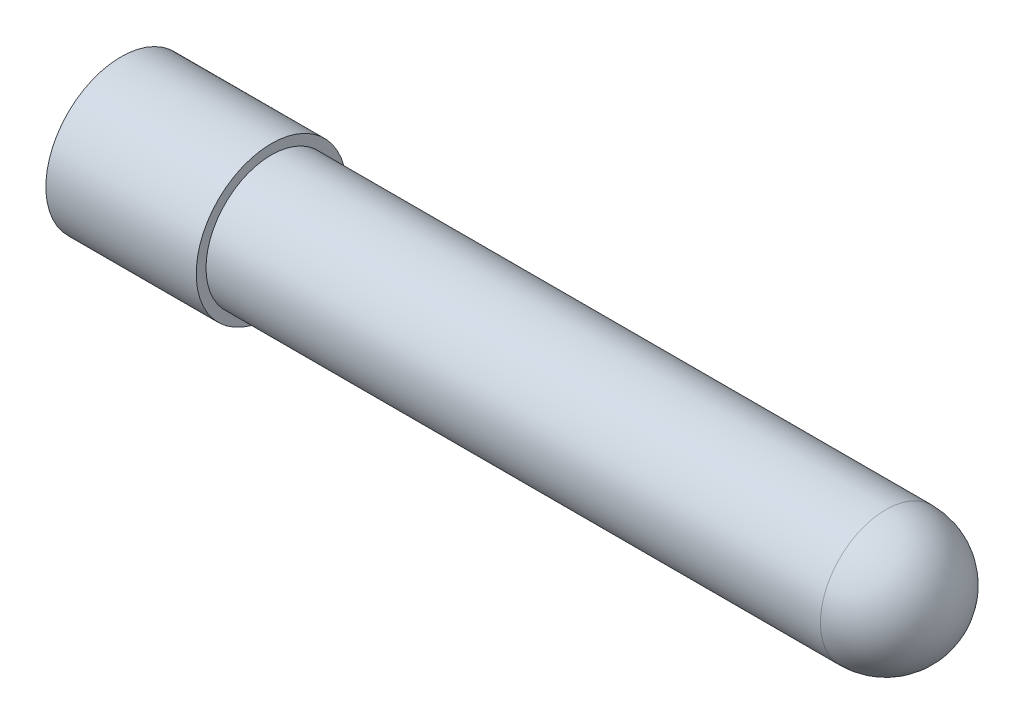
ISO-10303-21;
HEADER;
FILE_DESCRIPTION(('STEP AP214'),'2;1');
FILE_NAME('part.step','',(''),(''),'','','');
FILE_SCHEMA(('AUTOMOTIVE_DESIGN { 1 0 10303 214 1 1 1 1 }'));
ENDSEC;
DATA;
#1=APPLICATION_CONTEXT('core data for automotive mechanical design processes');
#2=APPLICATION_PROTOCOL_DEFINITION('international standard','automotive_design',2000,#1);
#3=PRODUCT_CONTEXT('',#1,'mechanical');
#4=PRODUCT('Part','Part','',(#3));
#5=PRODUCT_RELATED_PRODUCT_CATEGORY('part','',(#4));
#6=PRODUCT_DEFINITION_FORMATION('','',#4);
#7=PRODUCT_DEFINITION_CONTEXT('part definition',#1,'design');
#8=PRODUCT_DEFINITION('design','',#6,#7);
#9=PRODUCT_DEFINITION_SHAPE('','',#8);
#10=(LENGTH_UNIT() NAMED_UNIT(*) SI_UNIT(.MILLI.,.METRE.));
#11=(NAMED_UNIT(*) PLANE_ANGLE_UNIT() SI_UNIT($,.RADIAN.));
#12=(NAMED_UNIT(*) SI_UNIT($,.STERADIAN.) SOLID_ANGLE_UNIT());
#13=UNCERTAINTY_MEASURE_WITH_UNIT(LENGTH_MEASURE(1.E-05),#10,'distance_accuracy_value','');
#14=(GEOMETRIC_REPRESENTATION_CONTEXT(3) GLOBAL_UNCERTAINTY_ASSIGNED_CONTEXT((#13)) GLOBAL_UNIT_ASSIGNED_CONTEXT((#10,
#11,#12)) REPRESENTATION_CONTEXT('',''));
#15=CARTESIAN_POINT('',(0.,0.,0.));
#16=DIRECTION('',(0.,0.,1.));
#17=DIRECTION('',(1.,0.,0.));
#18=AXIS2_PLACEMENT_3D('',#15,#16,#17);
#19=CARTESIAN_POINT('',(11.5,0.,0.));
#20=DIRECTION('',(-1.,0.,0.));
#21=DIRECTION('',(0.,0.,1.));
#22=AXIS2_PLACEMENT_3D('',#19,#20,#21);
#23=CYLINDRICAL_SURFACE('',#22,5.75);
#24=CARTESIAN_POINT('',(11.5,0.,0.));
#25=DIRECTION('',(1.,0.,0.));
#26=DIRECTION('',(0.,0.,-1.));
#27=AXIS2_PLACEMENT_3D('',#24,#25,#26);
#28=CIRCLE('',#27,5.75);
#29=CARTESIAN_POINT('',(11.5,0.,-5.75));
#30=VERTEX_POINT('',#29);
#31=EDGE_CURVE('E44',#30,#30,#28,.T.);
#32=ORIENTED_EDGE('',*,*,#31,.F.);
#33=EDGE_LOOP('',(#32));
#34=FACE_BOUND('',#33,.T.);
#35=CARTESIAN_POINT('',(0.,0.,0.));
#36=DIRECTION('',(1.,0.,0.));
#37=DIRECTION('',(0.,0.,-1.));
#38=AXIS2_PLACEMENT_3D('',#35,#36,#37);
#39=CIRCLE('',#38,5.75);
#40=CARTESIAN_POINT('',(0.,0.,-5.75));
#41=VERTEX_POINT('',#40);
#42=EDGE_CURVE('E49',#41,#41,#39,.T.);
#43=ORIENTED_EDGE('',*,*,#42,.T.);
#44=EDGE_LOOP('',(#43));
#45=FACE_BOUND('',#44,.T.);
#46=ADVANCED_FACE('F33',(#34,#45),#23,.T.);
#47=CARTESIAN_POINT('',(11.5,0.,0.));
#48=DIRECTION('',(1.,0.,0.));
#49=DIRECTION('',(0.,0.,-1.));
#50=AXIS2_PLACEMENT_3D('',#47,#48,#49);
#51=PLANE('',#50);
#52=CARTESIAN_POINT('',(11.5,0.,0.));
#53=DIRECTION('',(1.,0.,0.));
#54=DIRECTION('',(0.,0.,-1.));
#55=AXIS2_PLACEMENT_3D('',#52,#53,#54);
#56=CIRCLE('',#55,5.);
#57=CARTESIAN_POINT('',(11.5,0.,-5.));
#58=VERTEX_POINT('',#57);
#59=EDGE_CURVE('E40',#58,#58,#56,.T.);
#60=ORIENTED_EDGE('',*,*,#59,.F.);
#61=EDGE_LOOP('',(#60));
#62=FACE_BOUND('',#61,.T.);
#63=ORIENTED_EDGE('',*,*,#31,.T.);
#64=EDGE_LOOP('',(#63));
#65=FACE_BOUND('',#64,.T.);
#66=ADVANCED_FACE('F70',(#62,#65),#51,.T.);
#67=CARTESIAN_POINT('',(0.,0.,0.));
#68=DIRECTION('',(1.,0.,0.));
#69=DIRECTION('',(0.,0.,-1.));
#70=AXIS2_PLACEMENT_3D('',#67,#68,#69);
#71=PLANE('',#70);
#72=CARTESIAN_POINT('',(0.,0.,0.));
#73=DIRECTION('',(-1.,0.,0.));
#74=DIRECTION('',(0.,0.,1.));
#75=AXIS2_PLACEMENT_3D('',#72,#73,#74);
#76=CIRCLE('',#75,3.);
#77=CARTESIAN_POINT('',(0.,0.,3.));
#78=VERTEX_POINT('',#77);
#79=EDGE_CURVE('E52',#78,#78,#76,.T.);
#80=ORIENTED_EDGE('',*,*,#79,.F.);
#81=EDGE_LOOP('',(#80));
#82=FACE_BOUND('',#81,.T.);
#83=ORIENTED_EDGE('',*,*,#42,.F.);
#84=EDGE_LOOP('',(#83));
#85=FACE_BOUND('',#84,.T.);
#86=ADVANCED_FACE('F66',(#82,#85),#71,.F.);
#87=CARTESIAN_POINT('',(63.5,0.,0.));
#88=DIRECTION('',(-1.,0.,0.));
#89=DIRECTION('',(0.,0.,1.));
#90=AXIS2_PLACEMENT_3D('',#87,#88,#89);
#91=CYLINDRICAL_SURFACE('',#90,5.);
#92=CARTESIAN_POINT('',(58.5,0.,0.));
#93=DIRECTION('',(-1.,0.,0.));
#94=DIRECTION('',(0.,0.,1.));
#95=AXIS2_PLACEMENT_3D('',#92,#93,#94);
#96=CIRCLE('',#95,5.);
#97=CARTESIAN_POINT('',(58.5,0.,5.));
#98=VERTEX_POINT('',#97);
#99=EDGE_CURVE('E10',#98,#98,#96,.T.);
#100=ORIENTED_EDGE('',*,*,#99,.T.);
#101=EDGE_LOOP('',(#100));
#102=FACE_BOUND('',#101,.T.);
#103=ORIENTED_EDGE('',*,*,#59,.T.);
#104=EDGE_LOOP('',(#103));
#105=FACE_BOUND('',#104,.T.);
#106=ADVANCED_FACE('F69',(#102,#105),#91,.T.);
#107=CARTESIAN_POINT('',(58.5,0.,0.));
#108=DIRECTION('',(-1.,0.,0.));
#109=DIRECTION('',(0.,0.,1.));
#110=AXIS2_PLACEMENT_3D('',#107,#108,#109);
#111=SPHERICAL_SURFACE('',#110,5.);
#112=ORIENTED_EDGE('',*,*,#99,.F.);
#113=EDGE_LOOP('',(#112));
#114=FACE_BOUND('',#113,.T.);
#115=ADVANCED_FACE('F35',(#114),#111,.T.);
#116=CARTESIAN_POINT('',(4.,0.,0.));
#117=DIRECTION('',(-1.,0.,0.));
#118=DIRECTION('',(0.,0.,1.));
#119=AXIS2_PLACEMENT_3D('',#116,#117,#118);
#120=CYLINDRICAL_SURFACE('',#119,3.);
#121=CARTESIAN_POINT('',(4.,0.,0.));
#122=DIRECTION('',(-1.,0.,0.));
#123=DIRECTION('',(0.,0.,1.));
#124=AXIS2_PLACEMENT_3D('',#121,#122,#123);
#125=CIRCLE('',#124,3.);
#126=CARTESIAN_POINT('',(4.,0.,3.));
#127=VERTEX_POINT('',#126);
#128=EDGE_CURVE('E55',#127,#127,#125,.T.);
#129=ORIENTED_EDGE('',*,*,#128,.F.);
#130=EDGE_LOOP('',(#129));
#131=FACE_BOUND('',#130,.T.);
#132=ORIENTED_EDGE('',*,*,#79,.T.);
#133=EDGE_LOOP('',(#132));
#134=FACE_BOUND('',#133,.T.);
#135=ADVANCED_FACE('F64',(#131,#134),#120,.F.);
#136=CARTESIAN_POINT('',(4.,0.,0.));
#137=DIRECTION('',(-1.,0.,0.));
#138=DIRECTION('',(0.,0.,1.));
#139=AXIS2_PLACEMENT_3D('',#136,#137,#138);
#140=PLANE('',#139);
#141=ORIENTED_EDGE('',*,*,#128,.T.);
#142=EDGE_LOOP('',(#141));
#143=FACE_BOUND('',#142,.T.);
#144=ADVANCED_FACE('F116',(#143),#140,.T.);
#145=CLOSED_SHELL('',(#46,#66,#86,#106,#115,#135,#144));
#146=MANIFOLD_SOLID_BREP('B2',#145);
#147=ADVANCED_BREP_SHAPE_REPRESENTATION('',(#18,#146),#14);
#148=SHAPE_DEFINITION_REPRESENTATION(#9,#147);
ENDSEC;
END-ISO-10303-21;
